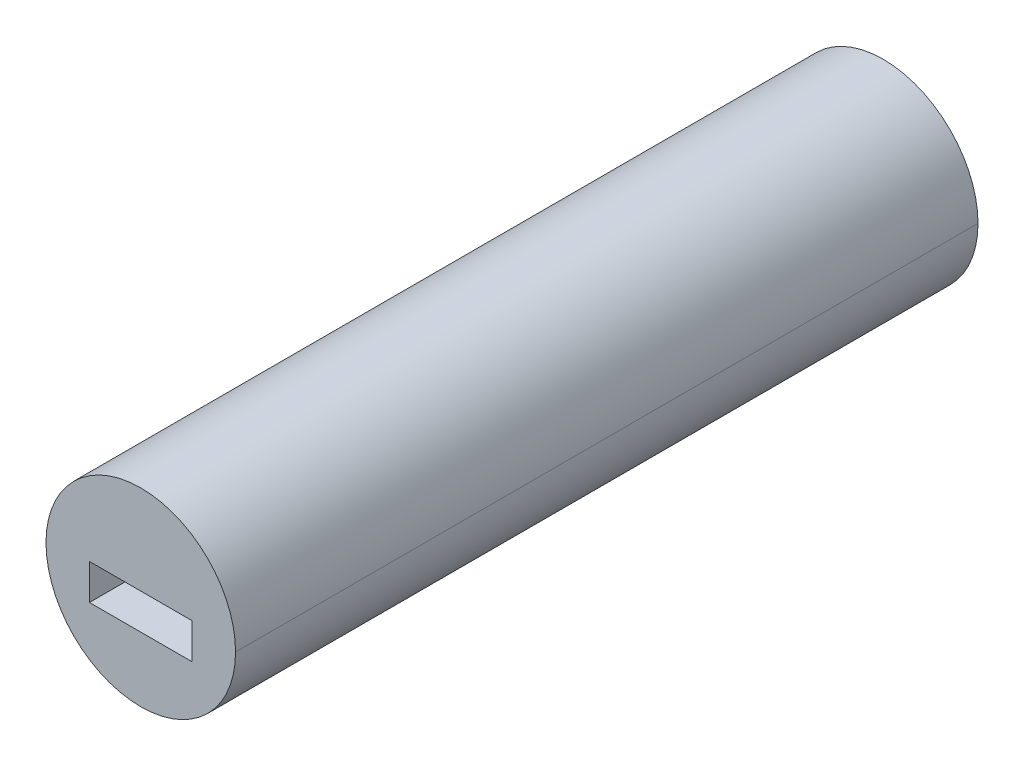
ISO-10303-21;
HEADER;
FILE_DESCRIPTION(('STEP AP214'),'2;1');
FILE_NAME('part.step','',(''),(''),'','','');
FILE_SCHEMA(('AUTOMOTIVE_DESIGN { 1 0 10303 214 1 1 1 1 }'));
ENDSEC;
DATA;
#1=APPLICATION_CONTEXT('core data for automotive mechanical design processes');
#2=APPLICATION_PROTOCOL_DEFINITION('international standard','automotive_design',2000,#1);
#3=PRODUCT_CONTEXT('',#1,'mechanical');
#4=PRODUCT('Part','Part','',(#3));
#5=PRODUCT_RELATED_PRODUCT_CATEGORY('part','',(#4));
#6=PRODUCT_DEFINITION_FORMATION('','',#4);
#7=PRODUCT_DEFINITION_CONTEXT('part definition',#1,'design');
#8=PRODUCT_DEFINITION('design','',#6,#7);
#9=PRODUCT_DEFINITION_SHAPE('','',#8);
#10=(LENGTH_UNIT() NAMED_UNIT(*) SI_UNIT(.MILLI.,.METRE.));
#11=(NAMED_UNIT(*) PLANE_ANGLE_UNIT() SI_UNIT($,.RADIAN.));
#12=(NAMED_UNIT(*) SI_UNIT($,.STERADIAN.) SOLID_ANGLE_UNIT());
#13=UNCERTAINTY_MEASURE_WITH_UNIT(LENGTH_MEASURE(1.E-05),#10,'distance_accuracy_value','');
#14=(GEOMETRIC_REPRESENTATION_CONTEXT(3) GLOBAL_UNCERTAINTY_ASSIGNED_CONTEXT((#13)) GLOBAL_UNIT_ASSIGNED_CONTEXT((#10,
#11,#12)) REPRESENTATION_CONTEXT('',''));
#15=CARTESIAN_POINT('',(0.,0.,0.));
#16=DIRECTION('',(0.,0.,1.));
#17=DIRECTION('',(1.,0.,0.));
#18=AXIS2_PLACEMENT_3D('',#15,#16,#17);
#19=CARTESIAN_POINT('',(0.,0.,69.));
#20=DIRECTION('',(0.,0.,-1.));
#21=DIRECTION('',(-1.,0.,0.));
#22=AXIS2_PLACEMENT_3D('',#19,#20,#21);
#23=CYLINDRICAL_SURFACE('',#22,12.);
#24=CARTESIAN_POINT('',(0.,0.,94.));
#25=DIRECTION('',(0.,0.,1.));
#26=DIRECTION('',(1.,0.,0.));
#27=AXIS2_PLACEMENT_3D('',#24,#25,#26);
#28=CIRCLE('',#27,12.);
#29=CARTESIAN_POINT('',(12.,0.,94.));
#30=VERTEX_POINT('',#29);
#31=CARTESIAN_POINT('',(-12.,0.,94.));
#32=VERTEX_POINT('',#31);
#33=EDGE_CURVE('E42',#30,#32,#28,.T.);
#34=ORIENTED_EDGE('',*,*,#33,.F.);
#35=DIRECTION('',(0.,0.,-1.));
#36=VECTOR('',#35,1.);
#37=CARTESIAN_POINT('',(12.,0.,69.));
#38=LINE('',#37,#36);
#39=CARTESIAN_POINT('',(12.,0.,0.));
#40=VERTEX_POINT('',#39);
#41=EDGE_CURVE('E11',#30,#40,#38,.T.);
#42=ORIENTED_EDGE('',*,*,#41,.T.);
#43=CARTESIAN_POINT('',(0.,0.,0.));
#44=DIRECTION('',(0.,0.,1.));
#45=DIRECTION('',(1.,0.,0.));
#46=AXIS2_PLACEMENT_3D('',#43,#44,#45);
#47=CIRCLE('',#46,12.);
#48=CARTESIAN_POINT('',(-12.,0.,0.));
#49=VERTEX_POINT('',#48);
#50=EDGE_CURVE('E28',#40,#49,#47,.T.);
#51=ORIENTED_EDGE('',*,*,#50,.T.);
#52=DIRECTION('',(0.,0.,-1.));
#53=VECTOR('',#52,1.);
#54=CARTESIAN_POINT('',(-12.,0.,69.));
#55=LINE('',#54,#53);
#56=EDGE_CURVE('E113',#32,#49,#55,.T.);
#57=ORIENTED_EDGE('',*,*,#56,.F.);
#58=EDGE_LOOP('',(#34,#42,#51,#57));
#59=FACE_BOUND('',#58,.T.);
#60=ADVANCED_FACE('F17',(#59),#23,.T.);
#61=CARTESIAN_POINT('',(0.,0.,69.));
#62=DIRECTION('',(0.,0.,-1.));
#63=DIRECTION('',(-1.,0.,0.));
#64=AXIS2_PLACEMENT_3D('',#61,#62,#63);
#65=CYLINDRICAL_SURFACE('',#64,12.);
#66=ORIENTED_EDGE('',*,*,#41,.F.);
#67=CARTESIAN_POINT('',(0.,0.,94.));
#68=DIRECTION('',(0.,0.,1.));
#69=DIRECTION('',(1.,0.,0.));
#70=AXIS2_PLACEMENT_3D('',#67,#68,#69);
#71=CIRCLE('',#70,12.);
#72=EDGE_CURVE('E124',#32,#30,#71,.T.);
#73=ORIENTED_EDGE('',*,*,#72,.F.);
#74=ORIENTED_EDGE('',*,*,#56,.T.);
#75=CARTESIAN_POINT('',(0.,0.,0.));
#76=DIRECTION('',(0.,0.,1.));
#77=DIRECTION('',(1.,0.,0.));
#78=AXIS2_PLACEMENT_3D('',#75,#76,#77);
#79=CIRCLE('',#78,12.);
#80=EDGE_CURVE('E114',#49,#40,#79,.T.);
#81=ORIENTED_EDGE('',*,*,#80,.T.);
#82=EDGE_LOOP('',(#66,#73,#74,#81));
#83=FACE_BOUND('',#82,.T.);
#84=ADVANCED_FACE('F187',(#83),#65,.T.);
#85=CARTESIAN_POINT('',(0.,0.,0.));
#86=DIRECTION('',(0.,0.,1.));
#87=DIRECTION('',(1.,0.,0.));
#88=AXIS2_PLACEMENT_3D('',#85,#86,#87);
#89=PLANE('',#88);
#90=ORIENTED_EDGE('',*,*,#80,.F.);
#91=ORIENTED_EDGE('',*,*,#50,.F.);
#92=EDGE_LOOP('',(#90,#91));
#93=FACE_BOUND('',#92,.T.);
#94=ADVANCED_FACE('F191',(#93),#89,.F.);
#95=CARTESIAN_POINT('',(0.,0.,94.));
#96=DIRECTION('',(0.,0.,1.));
#97=DIRECTION('',(1.,0.,0.));
#98=AXIS2_PLACEMENT_3D('',#95,#96,#97);
#99=PLANE('',#98);
#100=ORIENTED_EDGE('',*,*,#72,.T.);
#101=ORIENTED_EDGE('',*,*,#33,.T.);
#102=EDGE_LOOP('',(#100,#101));
#103=FACE_BOUND('',#102,.T.);
#104=DIRECTION('',(-1.,0.,0.));
#105=VECTOR('',#104,1.);
#106=CARTESIAN_POINT('',(-6.5,0.684428442877107,94.));
#107=LINE('',#106,#105);
#108=CARTESIAN_POINT('',(6.5,0.684428442877107,94.));
#109=VERTEX_POINT('',#108);
#110=CARTESIAN_POINT('',(-6.5,0.684428442877107,94.));
#111=VERTEX_POINT('',#110);
#112=EDGE_CURVE('E92',#109,#111,#107,.T.);
#113=ORIENTED_EDGE('',*,*,#112,.F.);
#114=DIRECTION('',(0.,1.,0.));
#115=VECTOR('',#114,1.);
#116=CARTESIAN_POINT('',(6.5,0.684428442877107,94.));
#117=LINE('',#116,#115);
#118=CARTESIAN_POINT('',(6.5,-3.8155715571229,94.));
#119=VERTEX_POINT('',#118);
#120=EDGE_CURVE('E21',#119,#109,#117,.T.);
#121=ORIENTED_EDGE('',*,*,#120,.F.);
#122=DIRECTION('',(1.,0.,0.));
#123=VECTOR('',#122,1.);
#124=CARTESIAN_POINT('',(-6.5,-3.8155715571229,94.));
#125=LINE('',#124,#123);
#126=CARTESIAN_POINT('',(-6.5,-3.8155715571229,94.));
#127=VERTEX_POINT('',#126);
#128=EDGE_CURVE('E77',#127,#119,#125,.T.);
#129=ORIENTED_EDGE('',*,*,#128,.F.);
#130=DIRECTION('',(0.,-1.,0.));
#131=VECTOR('',#130,1.);
#132=CARTESIAN_POINT('',(-6.5,0.684428442877107,94.));
#133=LINE('',#132,#131);
#134=EDGE_CURVE('E145',#111,#127,#133,.T.);
#135=ORIENTED_EDGE('',*,*,#134,.F.);
#136=EDGE_LOOP('',(#113,#121,#129,#135));
#137=FACE_BOUND('',#136,.T.);
#138=ADVANCED_FACE('F19',(#103,#137),#99,.T.);
#139=CARTESIAN_POINT('',(6.5,0.684428442877107,94.));
#140=DIRECTION('',(-1.,0.,0.));
#141=DIRECTION('',(0.,0.,1.));
#142=AXIS2_PLACEMENT_3D('',#139,#140,#141);
#143=PLANE('',#142);
#144=DIRECTION('',(0.,1.,0.));
#145=VECTOR('',#144,1.);
#146=CARTESIAN_POINT('',(6.5,0.684428442877107,69.));
#147=LINE('',#146,#145);
#148=CARTESIAN_POINT('',(6.5,-3.8155715571229,69.));
#149=VERTEX_POINT('',#148);
#150=CARTESIAN_POINT('',(6.5,0.684428442877107,69.));
#151=VERTEX_POINT('',#150);
#152=EDGE_CURVE('E101',#149,#151,#147,.T.);
#153=ORIENTED_EDGE('',*,*,#152,.F.);
#154=DIRECTION('',(0.,0.,-1.));
#155=VECTOR('',#154,1.);
#156=CARTESIAN_POINT('',(6.5,-3.8155715571229,94.));
#157=LINE('',#156,#155);
#158=EDGE_CURVE('E82',#119,#149,#157,.T.);
#159=ORIENTED_EDGE('',*,*,#158,.F.);
#160=ORIENTED_EDGE('',*,*,#120,.T.);
#161=DIRECTION('',(0.,0.,-1.));
#162=VECTOR('',#161,1.);
#163=CARTESIAN_POINT('',(6.5,0.684428442877107,94.));
#164=LINE('',#163,#162);
#165=EDGE_CURVE('E97',#109,#151,#164,.T.);
#166=ORIENTED_EDGE('',*,*,#165,.T.);
#167=EDGE_LOOP('',(#153,#159,#160,#166));
#168=FACE_BOUND('',#167,.T.);
#169=ADVANCED_FACE('F99',(#168),#143,.T.);
#170=CARTESIAN_POINT('',(-6.5,0.684428442877107,94.));
#171=DIRECTION('',(0.,-1.,0.));
#172=DIRECTION('',(0.,0.,-1.));
#173=AXIS2_PLACEMENT_3D('',#170,#171,#172);
#174=PLANE('',#173);
#175=DIRECTION('',(-1.,0.,0.));
#176=VECTOR('',#175,1.);
#177=CARTESIAN_POINT('',(-6.5,0.684428442877107,69.));
#178=LINE('',#177,#176);
#179=CARTESIAN_POINT('',(-6.5,0.684428442877107,69.));
#180=VERTEX_POINT('',#179);
#181=EDGE_CURVE('E109',#151,#180,#178,.T.);
#182=ORIENTED_EDGE('',*,*,#181,.F.);
#183=ORIENTED_EDGE('',*,*,#165,.F.);
#184=ORIENTED_EDGE('',*,*,#112,.T.);
#185=DIRECTION('',(0.,0.,-1.));
#186=VECTOR('',#185,1.);
#187=CARTESIAN_POINT('',(-6.5,0.684428442877107,94.));
#188=LINE('',#187,#186);
#189=EDGE_CURVE('E142',#111,#180,#188,.T.);
#190=ORIENTED_EDGE('',*,*,#189,.T.);
#191=EDGE_LOOP('',(#182,#183,#184,#190));
#192=FACE_BOUND('',#191,.T.);
#193=ADVANCED_FACE('F152',(#192),#174,.T.);
#194=CARTESIAN_POINT('',(-6.5,0.684428442877107,94.));
#195=DIRECTION('',(1.,0.,0.));
#196=DIRECTION('',(0.,1.,0.));
#197=AXIS2_PLACEMENT_3D('',#194,#195,#196);
#198=PLANE('',#197);
#199=DIRECTION('',(0.,-1.,0.));
#200=VECTOR('',#199,1.);
#201=CARTESIAN_POINT('',(-6.5,0.684428442877107,69.));
#202=LINE('',#201,#200);
#203=CARTESIAN_POINT('',(-6.5,-3.8155715571229,69.));
#204=VERTEX_POINT('',#203);
#205=EDGE_CURVE('E138',#180,#204,#202,.T.);
#206=ORIENTED_EDGE('',*,*,#205,.F.);
#207=ORIENTED_EDGE('',*,*,#189,.F.);
#208=ORIENTED_EDGE('',*,*,#134,.T.);
#209=DIRECTION('',(0.,0.,-1.));
#210=VECTOR('',#209,1.);
#211=CARTESIAN_POINT('',(-6.5,-3.8155715571229,94.));
#212=LINE('',#211,#210);
#213=EDGE_CURVE('E85',#127,#204,#212,.T.);
#214=ORIENTED_EDGE('',*,*,#213,.T.);
#215=EDGE_LOOP('',(#206,#207,#208,#214));
#216=FACE_BOUND('',#215,.T.);
#217=ADVANCED_FACE('F155',(#216),#198,.T.);
#218=CARTESIAN_POINT('',(-6.5,-3.8155715571229,94.));
#219=DIRECTION('',(0.,1.,0.));
#220=DIRECTION('',(1.,0.,0.));
#221=AXIS2_PLACEMENT_3D('',#218,#219,#220);
#222=PLANE('',#221);
#223=DIRECTION('',(1.,0.,0.));
#224=VECTOR('',#223,1.);
#225=CARTESIAN_POINT('',(-6.5,-3.8155715571229,69.));
#226=LINE('',#225,#224);
#227=EDGE_CURVE('E137',#204,#149,#226,.T.);
#228=ORIENTED_EDGE('',*,*,#227,.F.);
#229=ORIENTED_EDGE('',*,*,#213,.F.);
#230=ORIENTED_EDGE('',*,*,#128,.T.);
#231=ORIENTED_EDGE('',*,*,#158,.T.);
#232=EDGE_LOOP('',(#228,#229,#230,#231));
#233=FACE_BOUND('',#232,.T.);
#234=ADVANCED_FACE('F80',(#233),#222,.T.);
#235=CARTESIAN_POINT('',(0.,0.,69.));
#236=DIRECTION('',(0.,0.,1.));
#237=DIRECTION('',(1.,0.,0.));
#238=AXIS2_PLACEMENT_3D('',#235,#236,#237);
#239=PLANE('',#238);
#240=ORIENTED_EDGE('',*,*,#152,.T.);
#241=ORIENTED_EDGE('',*,*,#181,.T.);
#242=ORIENTED_EDGE('',*,*,#205,.T.);
#243=ORIENTED_EDGE('',*,*,#227,.T.);
#244=EDGE_LOOP('',(#240,#241,#242,#243));
#245=FACE_BOUND('',#244,.T.);
#246=ADVANCED_FACE('F224',(#245),#239,.T.);
#247=CLOSED_SHELL('',(#60,#84,#94,#138,#169,#193,#217,#234,#246));
#248=MANIFOLD_SOLID_BREP('B1',#247);
#249=ADVANCED_BREP_SHAPE_REPRESENTATION('',(#18,#248),#14);
#250=SHAPE_DEFINITION_REPRESENTATION(#9,#249);
ENDSEC;
END-ISO-10303-21;
